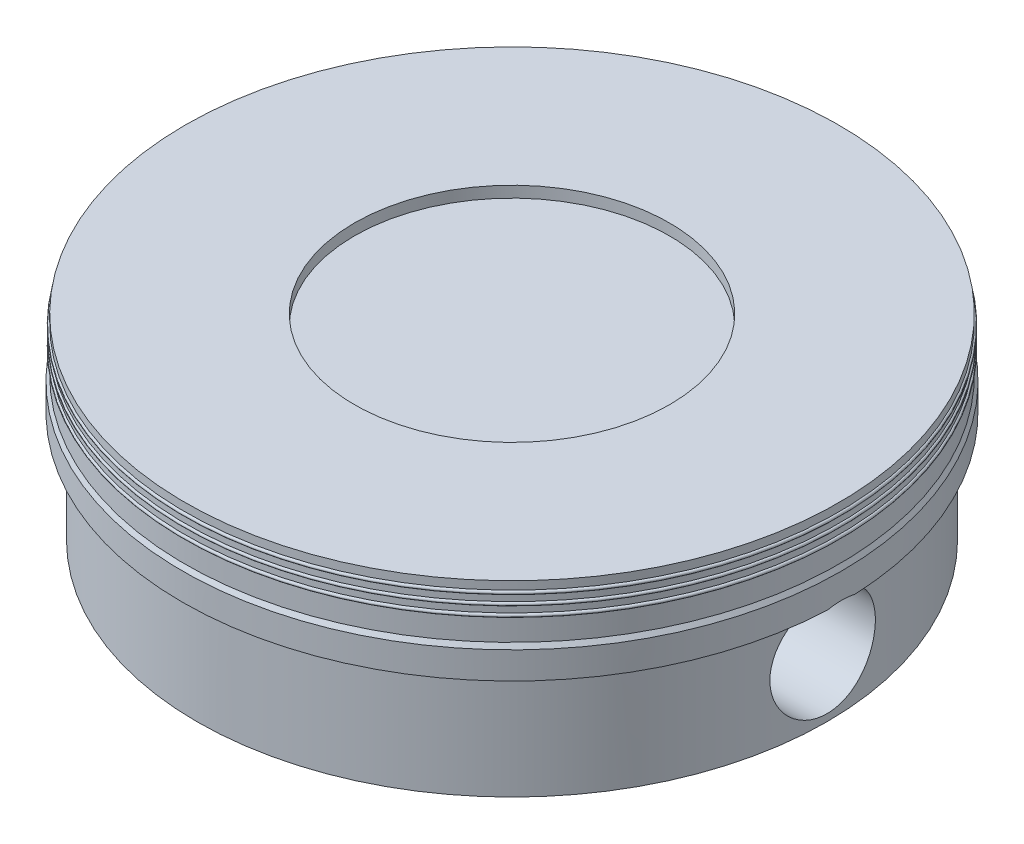
ISO-10303-21;
HEADER;
FILE_DESCRIPTION(('STEP AP214'),'2;1');
FILE_NAME('part.step','',(''),(''),'','','');
FILE_SCHEMA(('AUTOMOTIVE_DESIGN { 1 0 10303 214 1 1 1 1 }'));
ENDSEC;
DATA;
#1=APPLICATION_CONTEXT('core data for automotive mechanical design processes');
#2=APPLICATION_PROTOCOL_DEFINITION('international standard','automotive_design',2000,#1);
#3=PRODUCT_CONTEXT('',#1,'mechanical');
#4=PRODUCT('Part','Part','',(#3));
#5=PRODUCT_RELATED_PRODUCT_CATEGORY('part','',(#4));
#6=PRODUCT_DEFINITION_FORMATION('','',#4);
#7=PRODUCT_DEFINITION_CONTEXT('part definition',#1,'design');
#8=PRODUCT_DEFINITION('design','',#6,#7);
#9=PRODUCT_DEFINITION_SHAPE('','',#8);
#10=(LENGTH_UNIT() NAMED_UNIT(*) SI_UNIT(.MILLI.,.METRE.));
#11=(NAMED_UNIT(*) PLANE_ANGLE_UNIT() SI_UNIT($,.RADIAN.));
#12=(NAMED_UNIT(*) SI_UNIT($,.STERADIAN.) SOLID_ANGLE_UNIT());
#13=UNCERTAINTY_MEASURE_WITH_UNIT(LENGTH_MEASURE(1.E-05),#10,'distance_accuracy_value','');
#14=(GEOMETRIC_REPRESENTATION_CONTEXT(3) GLOBAL_UNCERTAINTY_ASSIGNED_CONTEXT((#13)) GLOBAL_UNIT_ASSIGNED_CONTEXT((#10,
#11,#12)) REPRESENTATION_CONTEXT('',''));
#15=CARTESIAN_POINT('',(0.,0.,0.));
#16=DIRECTION('',(0.,0.,1.));
#17=DIRECTION('',(1.,0.,0.));
#18=AXIS2_PLACEMENT_3D('',#15,#16,#17);
#19=CARTESIAN_POINT('',(5.,1.68,0.));
#20=DIRECTION('',(0.,1.,0.));
#21=DIRECTION('',(-1.,0.,0.));
#22=AXIS2_PLACEMENT_3D('',#19,#20,#21);
#23=PLANE('',#22);
#24=CARTESIAN_POINT('',(0.,1.68,0.));
#25=DIRECTION('',(0.,1.,0.));
#26=DIRECTION('',(-1.,0.,0.));
#27=AXIS2_PLACEMENT_3D('',#24,#25,#26);
#28=CIRCLE('',#27,5.);
#29=CARTESIAN_POINT('',(-4.99582848484613,1.68,0.204200269343622));
#30=VERTEX_POINT('',#29);
#31=CARTESIAN_POINT('',(4.99582848484613,1.68,0.204200269343603));
#32=VERTEX_POINT('',#31);
#33=EDGE_CURVE('E130',#30,#32,#28,.T.);
#34=ORIENTED_EDGE('',*,*,#33,.F.);
#35=DIRECTION('',(1.,0.,0.));
#36=VECTOR('',#35,1.);
#37=CARTESIAN_POINT('',(-5.,1.68,0.204200269343603));
#38=LINE('',#37,#36);
#39=CARTESIAN_POINT('',(-4.77563631885846,1.68,0.204200269343603));
#40=VERTEX_POINT('',#39);
#41=EDGE_CURVE('E116',#30,#40,#38,.T.);
#42=ORIENTED_EDGE('',*,*,#41,.T.);
#43=CARTESIAN_POINT('',(0.,1.68,0.));
#44=DIRECTION('',(0.,1.,0.));
#45=DIRECTION('',(-1.,0.,0.));
#46=AXIS2_PLACEMENT_3D('',#43,#44,#45);
#47=CIRCLE('',#46,4.78);
#48=CARTESIAN_POINT('',(4.77563631885846,1.68,0.204200269343603));
#49=VERTEX_POINT('',#48);
#50=EDGE_CURVE('E11',#40,#49,#47,.T.);
#51=ORIENTED_EDGE('',*,*,#50,.T.);
#52=EDGE_CURVE('E227',#49,#32,#38,.T.);
#53=ORIENTED_EDGE('',*,*,#52,.T.);
#54=EDGE_LOOP('',(#34,#42,#51,#53));
#55=FACE_BOUND('',#54,.T.);
#56=ADVANCED_FACE('F35',(#55),#23,.F.);
#57=CARTESIAN_POINT('',(0.,3.,0.));
#58=DIRECTION('',(0.,1.,0.));
#59=DIRECTION('',(-1.,0.,0.));
#60=AXIS2_PLACEMENT_3D('',#57,#58,#59);
#61=CYLINDRICAL_SURFACE('',#60,3.43);
#62=CARTESIAN_POINT('',(0.,1.93,0.));
#63=DIRECTION('',(0.,1.,0.));
#64=DIRECTION('',(-1.,0.,0.));
#65=AXIS2_PLACEMENT_3D('',#62,#63,#64);
#66=CIRCLE('',#65,3.43);
#67=CARTESIAN_POINT('',(-1.75,1.93,2.94998305079877));
#68=VERTEX_POINT('',#67);
#69=CARTESIAN_POINT('',(1.75,1.93,2.94998305079877));
#70=VERTEX_POINT('',#69);
#71=EDGE_CURVE('E172',#68,#70,#66,.T.);
#72=ORIENTED_EDGE('',*,*,#71,.T.);
#73=DIRECTION('',(0.,-1.,0.));
#74=VECTOR('',#73,1.);
#75=CARTESIAN_POINT('',(1.75,2.972,2.94998305079877));
#76=LINE('',#75,#74);
#77=CARTESIAN_POINT('',(1.75,0.,2.94998305079877));
#78=VERTEX_POINT('',#77);
#79=EDGE_CURVE('E212',#70,#78,#76,.T.);
#80=ORIENTED_EDGE('',*,*,#79,.T.);
#81=CARTESIAN_POINT('',(0.,0.,0.));
#82=DIRECTION('',(0.,1.,0.));
#83=DIRECTION('',(-1.,0.,0.));
#84=AXIS2_PLACEMENT_3D('',#81,#82,#83);
#85=CIRCLE('',#84,3.43);
#86=CARTESIAN_POINT('',(-1.75,0.,2.94998305079877));
#87=VERTEX_POINT('',#86);
#88=EDGE_CURVE('E176',#87,#78,#85,.T.);
#89=ORIENTED_EDGE('',*,*,#88,.F.);
#90=DIRECTION('',(0.,-1.,0.));
#91=VECTOR('',#90,1.);
#92=CARTESIAN_POINT('',(-1.75,2.972,2.94998305079877));
#93=LINE('',#92,#91);
#94=EDGE_CURVE('E190',#68,#87,#93,.T.);
#95=ORIENTED_EDGE('',*,*,#94,.F.);
#96=EDGE_LOOP('',(#72,#80,#89,#95));
#97=FACE_BOUND('',#96,.T.);
#98=ADVANCED_FACE('F263',(#97),#61,.F.);
#99=CARTESIAN_POINT('',(0.,3.,0.));
#100=DIRECTION('',(0.,1.,0.));
#101=DIRECTION('',(-1.,0.,0.));
#102=AXIS2_PLACEMENT_3D('',#99,#100,#101);
#103=CYLINDRICAL_SURFACE('',#102,4.78);
#104=ORIENTED_EDGE('',*,*,#50,.F.);
#105=CARTESIAN_POINT('',(-4.77563631885846,1.68,0.204200269343603));
#106=CARTESIAN_POINT('',(-4.77379194888552,1.66854243257558,0.247744412269054));
#107=CARTESIAN_POINT('',(-4.77136020460172,1.65335275457683,0.290255843607188));
#108=CARTESIAN_POINT('',(-4.76566971325088,1.61612915775609,0.372058639634254));
#109=CARTESIAN_POINT('',(-4.76241182877571,1.59410237237226,0.411353306756016));
#110=CARTESIAN_POINT('',(-4.75541096790896,1.54379414653229,0.485669109751176));
#111=CARTESIAN_POINT('',(-4.75166791325191,1.51551169641926,0.520689554352614));
#112=CARTESIAN_POINT('',(-4.7441177730141,1.45349253539822,0.58549949645576));
#113=CARTESIAN_POINT('',(-4.74031069015471,1.41975605577732,0.615289215663292));
#114=CARTESIAN_POINT('',(-4.73303397938829,1.34752861720671,0.668977437623689));
#115=CARTESIAN_POINT('',(-4.7295665140548,1.30901033693915,0.692839507782657));
#116=CARTESIAN_POINT('',(-4.72339287495312,1.22844891630057,0.733750408895798));
#117=CARTESIAN_POINT('',(-4.72068674764335,1.18640556102534,0.750798824093442));
#118=CARTESIAN_POINT('',(-4.71636619316509,1.10026975546907,0.777478565646626));
#119=CARTESIAN_POINT('',(-4.71474486267495,1.05619220830358,0.787156848877922));
#120=CARTESIAN_POINT('',(-4.71275674229363,0.9670136563161,0.798974764384114));
#121=CARTESIAN_POINT('',(-4.71238978474061,0.921912789084256,0.801115404155712));
#122=CARTESIAN_POINT('',(-4.71294983990002,0.832543950301081,0.797813291403515));
#123=CARTESIAN_POINT('',(-4.71386133355064,0.788272487173592,0.792461490734866));
#124=CARTESIAN_POINT('',(-4.71684522740922,0.701267723805095,0.774501739495545));
#125=CARTESIAN_POINT('',(-4.71891766125525,0.658534468171611,0.761893578672592));
#126=CARTESIAN_POINT('',(-4.72399067289901,0.575744688228178,0.729777359832175));
#127=CARTESIAN_POINT('',(-4.72699241086158,0.535691586324173,0.710260672658385));
#128=CARTESIAN_POINT('',(-4.73358706974061,0.459406153277857,0.664888734674945));
#129=CARTESIAN_POINT('',(-4.73718003553207,0.42317411250206,0.639033002650166));
#130=CARTESIAN_POINT('',(-4.74460835399527,0.355074083527152,0.58133129212891));
#131=CARTESIAN_POINT('',(-4.7484461869205,0.323266716440046,0.549414060942267));
#132=CARTESIAN_POINT('',(-4.75589481733857,0.265438415229614,0.480684029234228));
#133=CARTESIAN_POINT('',(-4.75950560740081,0.239417670418887,0.443871068609236));
#134=CARTESIAN_POINT('',(-4.76611282413811,0.1937973715957,0.366186649534608));
#135=CARTESIAN_POINT('',(-4.76910646912816,0.174226662901789,0.32529799680604));
#136=CARTESIAN_POINT('',(-4.77412075413143,0.142248751906518,0.240753384230137));
#137=CARTESIAN_POINT('',(-4.7761414668929,0.129841014000465,0.197097631561188));
#138=CARTESIAN_POINT('',(-4.77896522061506,0.112661038381091,0.108739604313492));
#139=CARTESIAN_POINT('',(-4.77978064110033,0.107811145780091,0.0640528262830545));
#140=CARTESIAN_POINT('',(-4.78014164687173,0.10565324910312,-0.0255061274608852));
#141=CARTESIAN_POINT('',(-4.77968730623721,0.108344805050244,-0.0703782922062025));
#142=CARTESIAN_POINT('',(-4.77756972345959,0.121126871649608,-0.158615600759262));
#143=CARTESIAN_POINT('',(-4.77591727299164,0.131151340047638,-0.201990600670468));
#144=CARTESIAN_POINT('',(-4.77159751597352,0.158221853564918,-0.286436829840957));
#145=CARTESIAN_POINT('',(-4.76893016987214,0.175268172332879,-0.327507969245552));
#146=CARTESIAN_POINT('',(-4.7628526422157,0.216013300231202,-0.406465125420052));
#147=CARTESIAN_POINT('',(-4.75943800733318,0.239752248368479,-0.444330074183007));
#148=CARTESIAN_POINT('',(-4.75224918030118,0.293172302894487,-0.515569319292179));
#149=CARTESIAN_POINT('',(-4.74847495896288,0.322853891882591,-0.548943250556444));
#150=CARTESIAN_POINT('',(-4.74093522146088,0.387737081541093,-0.610666430914075));
#151=CARTESIAN_POINT('',(-4.73717034238094,0.423000119473012,-0.638951217824218));
#152=CARTESIAN_POINT('',(-4.73012045867174,0.497814299963115,-0.689207240280687));
#153=CARTESIAN_POINT('',(-4.72683545162856,0.537365420948915,-0.711178507586887));
#154=CARTESIAN_POINT('',(-4.72112414577725,0.619631105385139,-0.748156766963228));
#155=CARTESIAN_POINT('',(-4.71869732861466,0.662343740332002,-0.763167964689323));
#156=CARTESIAN_POINT('',(-4.7149837872348,0.749733086105596,-0.785786717984053));
#157=CARTESIAN_POINT('',(-4.71369696033767,0.794409619661804,-0.793394940350896));
#158=CARTESIAN_POINT('',(-4.71242375066639,0.883861115660406,-0.800922574806884));
#159=CARTESIAN_POINT('',(-4.7124213386615,0.928627891215265,-0.800936758926199));
#160=CARTESIAN_POINT('',(-4.71367692374763,1.01752032814333,-0.793513476008895));
#161=CARTESIAN_POINT('',(-4.71493489933995,1.06164600043895,-0.786076136074611));
#162=CARTESIAN_POINT('',(-4.71855673227796,1.1477936410937,-0.764032135205492));
#163=CARTESIAN_POINT('',(-4.72091530598264,1.18982460995637,-0.74945971137407));
#164=CARTESIAN_POINT('',(-4.72646953445655,1.27084839334429,-0.713591784913732));
#165=CARTESIAN_POINT('',(-4.72966517057882,1.30984127552288,-0.692296432047113));
#166=CARTESIAN_POINT('',(-4.73657457074216,1.38412127913754,-0.64333270236432));
#167=CARTESIAN_POINT('',(-4.7402932895619,1.41936652165987,-0.615601505488131));
#168=CARTESIAN_POINT('',(-4.74781191338595,1.48475232853072,-0.554637638840496));
#169=CARTESIAN_POINT('',(-4.7516118616088,1.51489009525213,-0.521401973568509));
#170=CARTESIAN_POINT('',(-4.75890914569777,1.5694910175067,-0.44998379145258));
#171=CARTESIAN_POINT('',(-4.76240297685973,1.59389278081821,-0.411754019783339));
#172=CARTESIAN_POINT('',(-4.76864221547192,1.6358719961542,-0.331736125546161));
#173=CARTESIAN_POINT('',(-4.7713892580788,1.65346439427325,-0.28995604452154));
#174=CARTESIAN_POINT('',(-4.77434621611889,1.67200558892753,-0.232863171892918));
#175=CARTESIAN_POINT('',(-4.77502245159576,1.67620590067565,-0.2185828924918));
#176=CARTESIAN_POINT('',(-4.77563631885846,1.68,-0.204200269343603));
#177=B_SPLINE_CURVE_WITH_KNOTS('',3,(#105,#106,#107,#108,#109,#110,#111,#112,#113,#114,#115,
#116,#117,#118,#119,#120,#121,#122,#123,#124,#125,#126,#127,#128,#129,#130,#131,#132,#133,#134,
#135,#136,#137,#138,#139,#140,#141,#142,#143,#144,#145,#146,#147,#148,#149,#150,#151,#152,#153,
#154,#155,#156,#157,#158,#159,#160,#161,#162,#163,#164,#165,#166,#167,#168,#169,#170,#171,#172,
#173,#174,#175,#176),.UNSPECIFIED.,.F.,.F.,(4,2,2,2,2,2,2,2,2,2,2,2,2,2,2,2,2,2,2,2,2,2,2,2,2,2,
2,2,2,2,2,2,2,2,2,4),(0.,0.134994326225649,0.269848278013811,0.404724010973235,
0.539594025804639,0.675273538402806,0.81096132864847,0.945777214580323,1.08057508006346,
1.21375072872941,1.3469302363402,1.48027668341513,1.61363325633846,1.74866713589456,
1.88370543251019,2.01933969090956,2.15496380606526,2.28918500918092,2.42339838183809,
2.5564176455071,2.68944209356374,2.82328197712698,2.95713273418294,3.09257498984084,
3.22801656415072,3.36337619022746,3.4987236231104,3.63238190809012,3.76603791326899,
3.89905877507421,4.0320766738697,4.16645204477797,4.30090078374122,4.43672892789274,
4.57225722456914,4.61693329590087),.UNSPECIFIED.);
#178=CARTESIAN_POINT('',(-4.77563631885846,1.68,-0.204200269343603));
#179=VERTEX_POINT('',#178);
#180=EDGE_CURVE('E250',#40,#179,#177,.T.);
#181=ORIENTED_EDGE('',*,*,#180,.T.);
#182=CARTESIAN_POINT('',(4.77563631885846,1.68,-0.204200269343603));
#183=VERTEX_POINT('',#182);
#184=EDGE_CURVE('E45',#183,#179,#47,.T.);
#185=ORIENTED_EDGE('',*,*,#184,.F.);
#186=CARTESIAN_POINT('',(4.77563631885846,1.68,-0.204200269343603));
#187=CARTESIAN_POINT('',(4.77379194888552,1.66854243257558,-0.247744412269054));
#188=CARTESIAN_POINT('',(4.77136020460172,1.65335275457683,-0.290255843607188));
#189=CARTESIAN_POINT('',(4.76566971325088,1.61612915775609,-0.372058639634254));
#190=CARTESIAN_POINT('',(4.76241182877571,1.59410237237226,-0.411353306756016));
#191=CARTESIAN_POINT('',(4.75541096790896,1.54379414653229,-0.485669109751176));
#192=CARTESIAN_POINT('',(4.75166791325191,1.51551169641926,-0.520689554352614));
#193=CARTESIAN_POINT('',(4.7441177730141,1.45349253539822,-0.58549949645576));
#194=CARTESIAN_POINT('',(4.74031069015471,1.41975605577732,-0.615289215663292));
#195=CARTESIAN_POINT('',(4.73303397938829,1.34752861720671,-0.668977437623689));
#196=CARTESIAN_POINT('',(4.7295665140548,1.30901033693915,-0.692839507782657));
#197=CARTESIAN_POINT('',(4.72339287495312,1.22844891630057,-0.733750408895798));
#198=CARTESIAN_POINT('',(4.72068674764335,1.18640556102534,-0.750798824093442));
#199=CARTESIAN_POINT('',(4.71636619316509,1.10026975546907,-0.777478565646626));
#200=CARTESIAN_POINT('',(4.71474486267495,1.05619220830358,-0.787156848877922));
#201=CARTESIAN_POINT('',(4.71275674229363,0.9670136563161,-0.798974764384114));
#202=CARTESIAN_POINT('',(4.71238978474061,0.921912789084256,-0.801115404155712));
#203=CARTESIAN_POINT('',(4.71294983990002,0.832543950301081,-0.797813291403515));
#204=CARTESIAN_POINT('',(4.71386133355064,0.788272487173592,-0.792461490734866));
#205=CARTESIAN_POINT('',(4.71684522740922,0.701267723805095,-0.774501739495545));
#206=CARTESIAN_POINT('',(4.71891766125525,0.658534468171611,-0.761893578672592));
#207=CARTESIAN_POINT('',(4.72399067289901,0.575744688228178,-0.729777359832175));
#208=CARTESIAN_POINT('',(4.72699241086158,0.535691586324173,-0.710260672658385));
#209=CARTESIAN_POINT('',(4.73358706974061,0.459406153277857,-0.664888734674945));
#210=CARTESIAN_POINT('',(4.73718003553207,0.42317411250206,-0.639033002650166));
#211=CARTESIAN_POINT('',(4.74460835399527,0.355074083527152,-0.58133129212891));
#212=CARTESIAN_POINT('',(4.7484461869205,0.323266716440046,-0.549414060942267));
#213=CARTESIAN_POINT('',(4.75589481733857,0.265438415229614,-0.480684029234228));
#214=CARTESIAN_POINT('',(4.75950560740081,0.239417670418887,-0.443871068609236));
#215=CARTESIAN_POINT('',(4.76611282413811,0.1937973715957,-0.366186649534608));
#216=CARTESIAN_POINT('',(4.76910646912816,0.174226662901789,-0.32529799680604));
#217=CARTESIAN_POINT('',(4.77412075413143,0.142248751906518,-0.240753384230137));
#218=CARTESIAN_POINT('',(4.7761414668929,0.129841014000465,-0.197097631561188));
#219=CARTESIAN_POINT('',(4.77896522061506,0.112661038381091,-0.108739604313492));
#220=CARTESIAN_POINT('',(4.77978064110033,0.107811145780091,-0.0640528262830545));
#221=CARTESIAN_POINT('',(4.78014164687173,0.10565324910312,0.0255061274608852));
#222=CARTESIAN_POINT('',(4.77968730623721,0.108344805050244,0.0703782922062025));
#223=CARTESIAN_POINT('',(4.77756972345959,0.121126871649608,0.158615600759262));
#224=CARTESIAN_POINT('',(4.77591727299164,0.131151340047638,0.201990600670468));
#225=CARTESIAN_POINT('',(4.77159751597352,0.158221853564918,0.286436829840957));
#226=CARTESIAN_POINT('',(4.76893016987214,0.175268172332879,0.327507969245552));
#227=CARTESIAN_POINT('',(4.7628526422157,0.216013300231202,0.406465125420052));
#228=CARTESIAN_POINT('',(4.75943800733318,0.239752248368479,0.444330074183007));
#229=CARTESIAN_POINT('',(4.75224918030118,0.293172302894487,0.515569319292179));
#230=CARTESIAN_POINT('',(4.74847495896288,0.322853891882591,0.548943250556444));
#231=CARTESIAN_POINT('',(4.74093522146088,0.387737081541093,0.610666430914075));
#232=CARTESIAN_POINT('',(4.73717034238094,0.423000119473012,0.638951217824218));
#233=CARTESIAN_POINT('',(4.73012045867174,0.497814299963115,0.689207240280687));
#234=CARTESIAN_POINT('',(4.72683545162856,0.537365420948915,0.711178507586887));
#235=CARTESIAN_POINT('',(4.72112414577725,0.619631105385139,0.748156766963228));
#236=CARTESIAN_POINT('',(4.71869732861466,0.662343740332002,0.763167964689323));
#237=CARTESIAN_POINT('',(4.7149837872348,0.749733086105596,0.785786717984053));
#238=CARTESIAN_POINT('',(4.71369696033767,0.794409619661804,0.793394940350896));
#239=CARTESIAN_POINT('',(4.71242375066639,0.883861115660406,0.800922574806884));
#240=CARTESIAN_POINT('',(4.7124213386615,0.928627891215265,0.800936758926199));
#241=CARTESIAN_POINT('',(4.71367692374763,1.01752032814333,0.793513476008895));
#242=CARTESIAN_POINT('',(4.71493489933995,1.06164600043895,0.786076136074611));
#243=CARTESIAN_POINT('',(4.71855673227796,1.1477936410937,0.764032135205492));
#244=CARTESIAN_POINT('',(4.72091530598264,1.18982460995637,0.74945971137407));
#245=CARTESIAN_POINT('',(4.72646953445655,1.27084839334429,0.713591784913732));
#246=CARTESIAN_POINT('',(4.72966517057882,1.30984127552288,0.692296432047113));
#247=CARTESIAN_POINT('',(4.73657457074216,1.38412127913754,0.64333270236432));
#248=CARTESIAN_POINT('',(4.7402932895619,1.41936652165987,0.615601505488131));
#249=CARTESIAN_POINT('',(4.74781191338595,1.48475232853072,0.554637638840496));
#250=CARTESIAN_POINT('',(4.7516118616088,1.51489009525213,0.521401973568509));
#251=CARTESIAN_POINT('',(4.75890914569777,1.5694910175067,0.44998379145258));
#252=CARTESIAN_POINT('',(4.76240297685973,1.59389278081821,0.411754019783339));
#253=CARTESIAN_POINT('',(4.76864221547192,1.6358719961542,0.331736125546161));
#254=CARTESIAN_POINT('',(4.7713892580788,1.65346439427325,0.28995604452154));
#255=CARTESIAN_POINT('',(4.77434621611889,1.67200558892753,0.232863171892918));
#256=CARTESIAN_POINT('',(4.77502245159576,1.67620590067565,0.2185828924918));
#257=CARTESIAN_POINT('',(4.77563631885846,1.68,0.204200269343603));
#258=B_SPLINE_CURVE_WITH_KNOTS('',3,(#186,#187,#188,#189,#190,#191,#192,#193,#194,#195,#196,
#197,#198,#199,#200,#201,#202,#203,#204,#205,#206,#207,#208,#209,#210,#211,#212,#213,#214,#215,
#216,#217,#218,#219,#220,#221,#222,#223,#224,#225,#226,#227,#228,#229,#230,#231,#232,#233,#234,
#235,#236,#237,#238,#239,#240,#241,#242,#243,#244,#245,#246,#247,#248,#249,#250,#251,#252,#253,
#254,#255,#256,#257),.UNSPECIFIED.,.F.,.F.,(4,2,2,2,2,2,2,2,2,2,2,2,2,2,2,2,2,2,2,2,2,2,2,2,2,2,
2,2,2,2,2,2,2,2,2,4),(0.,0.134994326225649,0.269848278013811,0.404724010973235,
0.539594025804639,0.675273538402806,0.81096132864847,0.945777214580323,1.08057508006346,
1.21375072872941,1.3469302363402,1.48027668341513,1.61363325633846,1.74866713589456,
1.88370543251019,2.01933969090956,2.15496380606526,2.28918500918092,2.42339838183809,
2.5564176455071,2.68944209356374,2.82328197712698,2.95713273418294,3.09257498984084,
3.22801656415072,3.36337619022746,3.4987236231104,3.63238190809012,3.76603791326899,
3.89905877507421,4.0320766738697,4.16645204477797,4.30090078374122,4.43672892789274,
4.57225722456914,4.61693329590087),.UNSPECIFIED.);
#259=EDGE_CURVE('E219',#183,#49,#258,.T.);
#260=ORIENTED_EDGE('',*,*,#259,.T.);
#261=EDGE_LOOP('',(#104,#181,#185,#260));
#262=FACE_BOUND('',#261,.T.);
#263=CARTESIAN_POINT('',(0.,0.,0.));
#264=DIRECTION('',(0.,1.,0.));
#265=DIRECTION('',(-1.,0.,0.));
#266=AXIS2_PLACEMENT_3D('',#263,#264,#265);
#267=CIRCLE('',#266,4.78);
#268=CARTESIAN_POINT('',(-4.78,0.,0.));
#269=VERTEX_POINT('',#268);
#270=EDGE_CURVE('E180',#269,#269,#267,.T.);
#271=ORIENTED_EDGE('',*,*,#270,.T.);
#272=EDGE_LOOP('',(#271));
#273=FACE_BOUND('',#272,.T.);
#274=ADVANCED_FACE('F37',(#262,#273),#103,.T.);
#275=CARTESIAN_POINT('',(4.99582848484613,1.68,-0.204200269343622));
#276=VERTEX_POINT('',#275);
#277=CARTESIAN_POINT('',(-4.99582848484613,1.68,-0.204200269343603));
#278=VERTEX_POINT('',#277);
#279=EDGE_CURVE('E125',#276,#278,#28,.T.);
#280=ORIENTED_EDGE('',*,*,#279,.F.);
#281=DIRECTION('',(1.,0.,0.));
#282=VECTOR('',#281,1.);
#283=CARTESIAN_POINT('',(-5.,1.68,-0.204200269343603));
#284=LINE('',#283,#282);
#285=EDGE_CURVE('E128',#276,#183,#284,.F.);
#286=ORIENTED_EDGE('',*,*,#285,.T.);
#287=ORIENTED_EDGE('',*,*,#184,.T.);
#288=EDGE_CURVE('E113',#179,#278,#284,.F.);
#289=ORIENTED_EDGE('',*,*,#288,.T.);
#290=EDGE_LOOP('',(#280,#286,#287,#289));
#291=FACE_BOUND('',#290,.T.);
#292=ADVANCED_FACE('F123',(#291),#23,.F.);
#293=CARTESIAN_POINT('',(0.,3.,0.));
#294=DIRECTION('',(0.,1.,0.));
#295=DIRECTION('',(-1.,0.,0.));
#296=AXIS2_PLACEMENT_3D('',#293,#294,#295);
#297=CYLINDRICAL_SURFACE('',#296,5.);
#298=CARTESIAN_POINT('',(0.,2.09,0.));
#299=DIRECTION('',(0.,1.,0.));
#300=DIRECTION('',(-1.,0.,0.));
#301=AXIS2_PLACEMENT_3D('',#298,#299,#300);
#302=CIRCLE('',#301,5.);
#303=CARTESIAN_POINT('',(-5.,2.09,0.));
#304=VERTEX_POINT('',#303);
#305=EDGE_CURVE('E131',#304,#304,#302,.T.);
#306=ORIENTED_EDGE('',*,*,#305,.F.);
#307=EDGE_LOOP('',(#306));
#308=FACE_BOUND('',#307,.T.);
#309=ORIENTED_EDGE('',*,*,#33,.T.);
#310=CARTESIAN_POINT('',(4.99582848484613,1.68,0.204200269343603));
#311=CARTESIAN_POINT('',(4.99671726527622,1.68573567061046,0.182470448527012));
#312=CARTESIAN_POINT('',(4.99747214482284,1.69055442079515,0.160507025821703));
#313=CARTESIAN_POINT('',(4.99869771630284,1.69833005884354,0.116238538748057));
#314=CARTESIAN_POINT('',(4.99916832286338,1.70128638739636,0.0939333738078289));
#315=CARTESIAN_POINT('',(5.00011402038239,1.70722470830864,0.0277239484352171));
#316=CARTESIAN_POINT('',(5.00016427223512,1.7075354872144,-0.0164665349355051));
#317=CARTESIAN_POINT('',(4.9993452065729,1.7023978032236,-0.0844772002820847));
#318=CARTESIAN_POINT('',(4.99887889019159,1.69947412393192,-0.108529380491495));
#319=CARTESIAN_POINT('',(4.99760713721798,1.6914146067021,-0.156550261147517));
#320=CARTESIAN_POINT('',(4.99679767293207,1.68625247795534,-0.180514444994168));
#321=CARTESIAN_POINT('',(4.99582848484614,1.68000000000026,-0.204200269343623));
#322=B_SPLINE_CURVE_WITH_KNOTS('',3,(#310,#311,#312,#313,#314,#315,#316,#317,#318,#319,#320,
#321),.UNSPECIFIED.,.F.,.F.,(4,2,2,2,2,4),(0.,0.0674275414034377,0.134875322585593,
0.266729456884676,0.33934409468026,0.412835733322213),.UNSPECIFIED.);
#323=EDGE_CURVE('E52',#32,#276,#322,.T.);
#324=ORIENTED_EDGE('',*,*,#323,.T.);
#325=ORIENTED_EDGE('',*,*,#279,.T.);
#326=CARTESIAN_POINT('',(-4.99582848484613,1.68,-0.204200269343603));
#327=CARTESIAN_POINT('',(-4.99671726527622,1.68573567061046,-0.182470448527012));
#328=CARTESIAN_POINT('',(-4.99747214482284,1.69055442079515,-0.160507025821703));
#329=CARTESIAN_POINT('',(-4.99869771630284,1.69833005884354,-0.116238538748057));
#330=CARTESIAN_POINT('',(-4.99916832286338,1.70128638739636,-0.0939333738078289));
#331=CARTESIAN_POINT('',(-5.00011402038239,1.70722470830864,-0.0277239484352171));
#332=CARTESIAN_POINT('',(-5.00016427223512,1.7075354872144,0.0164665349355051));
#333=CARTESIAN_POINT('',(-4.9993452065729,1.7023978032236,0.0844772002820847));
#334=CARTESIAN_POINT('',(-4.99887889019159,1.69947412393192,0.108529380491495));
#335=CARTESIAN_POINT('',(-4.99760713721798,1.6914146067021,0.156550261147517));
#336=CARTESIAN_POINT('',(-4.99679767293207,1.68625247795534,0.180514444994168));
#337=CARTESIAN_POINT('',(-4.99582848484614,1.68000000000026,0.204200269343623));
#338=B_SPLINE_CURVE_WITH_KNOTS('',3,(#326,#327,#328,#329,#330,#331,#332,#333,#334,#335,#336,
#337),.UNSPECIFIED.,.F.,.F.,(4,2,2,2,2,4),(0.,0.0674275414034377,0.134875322585593,
0.266729456884676,0.33934409468026,0.412835733322213),.UNSPECIFIED.);
#339=EDGE_CURVE('E57',#278,#30,#338,.T.);
#340=ORIENTED_EDGE('',*,*,#339,.T.);
#341=EDGE_LOOP('',(#309,#324,#325,#340));
#342=FACE_BOUND('',#341,.T.);
#343=ADVANCED_FACE('F129',(#308,#342),#297,.T.);
#344=CARTESIAN_POINT('',(0.,2.09,0.));
#345=DIRECTION('',(0.,-1.,0.));
#346=DIRECTION('',(1.,0.,0.));
#347=AXIS2_PLACEMENT_3D('',#344,#345,#346);
#348=CONICAL_SURFACE('',#347,5.,0.519146114246523);
#349=CARTESIAN_POINT('',(0.,2.16,0.));
#350=DIRECTION('',(0.,1.,0.));
#351=DIRECTION('',(-1.,0.,0.));
#352=AXIS2_PLACEMENT_3D('',#349,#350,#351);
#353=CIRCLE('',#352,4.96);
#354=CARTESIAN_POINT('',(-4.96,2.16,0.));
#355=VERTEX_POINT('',#354);
#356=EDGE_CURVE('E134',#355,#355,#353,.T.);
#357=ORIENTED_EDGE('',*,*,#356,.F.);
#358=EDGE_LOOP('',(#357));
#359=FACE_BOUND('',#358,.T.);
#360=ORIENTED_EDGE('',*,*,#305,.T.);
#361=EDGE_LOOP('',(#360));
#362=FACE_BOUND('',#361,.T.);
#363=ADVANCED_FACE('F275',(#359,#362),#348,.T.);
#364=CARTESIAN_POINT('',(0.,3.,0.));
#365=DIRECTION('',(0.,1.,0.));
#366=DIRECTION('',(-1.,0.,0.));
#367=AXIS2_PLACEMENT_3D('',#364,#365,#366);
#368=CYLINDRICAL_SURFACE('',#367,4.96);
#369=CARTESIAN_POINT('',(0.,2.49353731935163,0.));
#370=DIRECTION('',(0.,1.,0.));
#371=DIRECTION('',(-1.,0.,0.));
#372=AXIS2_PLACEMENT_3D('',#369,#370,#371);
#373=CIRCLE('',#372,4.96);
#374=CARTESIAN_POINT('',(-4.96,2.49353731935163,0.));
#375=VERTEX_POINT('',#374);
#376=EDGE_CURVE('E139',#375,#375,#373,.T.);
#377=ORIENTED_EDGE('',*,*,#376,.F.);
#378=EDGE_LOOP('',(#377));
#379=FACE_BOUND('',#378,.T.);
#380=ORIENTED_EDGE('',*,*,#356,.T.);
#381=EDGE_LOOP('',(#380));
#382=FACE_BOUND('',#381,.T.);
#383=ADVANCED_FACE('F407',(#379,#382),#368,.T.);
#384=CARTESIAN_POINT('',(0.,2.52,0.));
#385=DIRECTION('',(0.,1.,0.));
#386=DIRECTION('',(-1.,0.,0.));
#387=AXIS2_PLACEMENT_3D('',#384,#385,#386);
#388=TOROIDAL_SURFACE('',#387,4.96,0.0264626806483672);
#389=CARTESIAN_POINT('',(0.,2.54646268064837,0.));
#390=DIRECTION('',(0.,1.,0.));
#391=DIRECTION('',(-1.,0.,0.));
#392=AXIS2_PLACEMENT_3D('',#389,#390,#391);
#393=CIRCLE('',#392,4.96);
#394=CARTESIAN_POINT('',(-4.96,2.54646268064837,0.));
#395=VERTEX_POINT('',#394);
#396=EDGE_CURVE('E142',#395,#395,#393,.T.);
#397=ORIENTED_EDGE('',*,*,#396,.F.);
#398=EDGE_LOOP('',(#397));
#399=FACE_BOUND('',#398,.T.);
#400=ORIENTED_EDGE('',*,*,#376,.T.);
#401=EDGE_LOOP('',(#400));
#402=FACE_BOUND('',#401,.T.);
#403=ADVANCED_FACE('F414',(#399,#402),#388,.T.);
#404=CARTESIAN_POINT('',(0.,3.,0.));
#405=DIRECTION('',(0.,1.,0.));
#406=DIRECTION('',(-1.,0.,0.));
#407=AXIS2_PLACEMENT_3D('',#404,#405,#406);
#408=CYLINDRICAL_SURFACE('',#407,4.96);
#409=CARTESIAN_POINT('',(0.,2.64476331004766,0.));
#410=DIRECTION('',(0.,1.,0.));
#411=DIRECTION('',(-1.,0.,0.));
#412=AXIS2_PLACEMENT_3D('',#409,#410,#411);
#413=CIRCLE('',#412,4.96);
#414=CARTESIAN_POINT('',(-4.96,2.64476331004766,0.));
#415=VERTEX_POINT('',#414);
#416=EDGE_CURVE('E145',#415,#415,#413,.T.);
#417=ORIENTED_EDGE('',*,*,#416,.F.);
#418=EDGE_LOOP('',(#417));
#419=FACE_BOUND('',#418,.T.);
#420=ORIENTED_EDGE('',*,*,#396,.T.);
#421=EDGE_LOOP('',(#420));
#422=FACE_BOUND('',#421,.T.);
#423=ADVANCED_FACE('F423',(#419,#422),#408,.T.);
#424=CARTESIAN_POINT('',(0.,2.67,0.));
#425=DIRECTION('',(0.,1.,0.));
#426=DIRECTION('',(-1.,0.,0.));
#427=AXIS2_PLACEMENT_3D('',#424,#425,#426);
#428=TOROIDAL_SURFACE('',#427,4.96,0.0252366899523406);
#429=CARTESIAN_POINT('',(0.,2.69523668995234,0.));
#430=DIRECTION('',(0.,1.,0.));
#431=DIRECTION('',(-1.,0.,0.));
#432=AXIS2_PLACEMENT_3D('',#429,#430,#431);
#433=CIRCLE('',#432,4.96);
#434=CARTESIAN_POINT('',(-4.96,2.69523668995234,0.));
#435=VERTEX_POINT('',#434);
#436=EDGE_CURVE('E148',#435,#435,#433,.T.);
#437=ORIENTED_EDGE('',*,*,#436,.F.);
#438=EDGE_LOOP('',(#437));
#439=FACE_BOUND('',#438,.T.);
#440=ORIENTED_EDGE('',*,*,#416,.T.);
#441=EDGE_LOOP('',(#440));
#442=FACE_BOUND('',#441,.T.);
#443=ADVANCED_FACE('F431',(#439,#442),#428,.T.);
#444=CARTESIAN_POINT('',(0.,3.,0.));
#445=DIRECTION('',(0.,1.,0.));
#446=DIRECTION('',(-1.,0.,0.));
#447=AXIS2_PLACEMENT_3D('',#444,#445,#446);
#448=CYLINDRICAL_SURFACE('',#447,4.96);
#449=CARTESIAN_POINT('',(0.,2.79353731935163,0.));
#450=DIRECTION('',(0.,1.,0.));
#451=DIRECTION('',(-1.,0.,0.));
#452=AXIS2_PLACEMENT_3D('',#449,#450,#451);
#453=CIRCLE('',#452,4.96);
#454=CARTESIAN_POINT('',(-4.96,2.79353731935163,0.));
#455=VERTEX_POINT('',#454);
#456=EDGE_CURVE('E151',#455,#455,#453,.T.);
#457=ORIENTED_EDGE('',*,*,#456,.F.);
#458=EDGE_LOOP('',(#457));
#459=FACE_BOUND('',#458,.T.);
#460=ORIENTED_EDGE('',*,*,#436,.T.);
#461=EDGE_LOOP('',(#460));
#462=FACE_BOUND('',#461,.T.);
#463=ADVANCED_FACE('F439',(#459,#462),#448,.T.);
#464=CARTESIAN_POINT('',(0.,2.82,0.));
#465=DIRECTION('',(0.,1.,0.));
#466=DIRECTION('',(-1.,0.,0.));
#467=AXIS2_PLACEMENT_3D('',#464,#465,#466);
#468=TOROIDAL_SURFACE('',#467,4.96,0.0264626806483672);
#469=CARTESIAN_POINT('',(0.,2.84646268064837,0.));
#470=DIRECTION('',(0.,1.,0.));
#471=DIRECTION('',(-1.,0.,0.));
#472=AXIS2_PLACEMENT_3D('',#469,#470,#471);
#473=CIRCLE('',#472,4.96);
#474=CARTESIAN_POINT('',(-4.96,2.84646268064837,0.));
#475=VERTEX_POINT('',#474);
#476=EDGE_CURVE('E154',#475,#475,#473,.T.);
#477=ORIENTED_EDGE('',*,*,#476,.F.);
#478=EDGE_LOOP('',(#477));
#479=FACE_BOUND('',#478,.T.);
#480=ORIENTED_EDGE('',*,*,#456,.T.);
#481=EDGE_LOOP('',(#480));
#482=FACE_BOUND('',#481,.T.);
#483=ADVANCED_FACE('F447',(#479,#482),#468,.T.);
#484=CARTESIAN_POINT('',(0.,3.,0.));
#485=DIRECTION('',(0.,1.,0.));
#486=DIRECTION('',(-1.,0.,0.));
#487=AXIS2_PLACEMENT_3D('',#484,#485,#486);
#488=CYLINDRICAL_SURFACE('',#487,4.96);
#489=CARTESIAN_POINT('',(0.,2.97,0.));
#490=DIRECTION('',(0.,1.,0.));
#491=DIRECTION('',(-1.,0.,0.));
#492=AXIS2_PLACEMENT_3D('',#489,#490,#491);
#493=CIRCLE('',#492,4.96);
#494=CARTESIAN_POINT('',(-4.96,2.97,0.));
#495=VERTEX_POINT('',#494);
#496=EDGE_CURVE('E157',#495,#495,#493,.T.);
#497=ORIENTED_EDGE('',*,*,#496,.F.);
#498=EDGE_LOOP('',(#497));
#499=FACE_BOUND('',#498,.T.);
#500=ORIENTED_EDGE('',*,*,#476,.T.);
#501=EDGE_LOOP('',(#500));
#502=FACE_BOUND('',#501,.T.);
#503=ADVANCED_FACE('F455',(#499,#502),#488,.T.);
#504=CARTESIAN_POINT('',(2.39,2.97,0.));
#505=DIRECTION('',(0.,-1.,0.));
#506=DIRECTION('',(1.,0.,0.));
#507=AXIS2_PLACEMENT_3D('',#504,#505,#506);
#508=PLANE('',#507);
#509=CARTESIAN_POINT('',(0.,2.97,0.));
#510=DIRECTION('',(0.,1.,0.));
#511=DIRECTION('',(-1.,0.,0.));
#512=AXIS2_PLACEMENT_3D('',#509,#510,#511);
#513=CIRCLE('',#512,2.39);
#514=CARTESIAN_POINT('',(-2.39,2.97,0.));
#515=VERTEX_POINT('',#514);
#516=EDGE_CURVE('E160',#515,#515,#513,.T.);
#517=ORIENTED_EDGE('',*,*,#516,.F.);
#518=EDGE_LOOP('',(#517));
#519=FACE_BOUND('',#518,.T.);
#520=ORIENTED_EDGE('',*,*,#496,.T.);
#521=EDGE_LOOP('',(#520));
#522=FACE_BOUND('',#521,.T.);
#523=ADVANCED_FACE('F462',(#519,#522),#508,.F.);
#524=CARTESIAN_POINT('',(0.,3.,0.));
#525=DIRECTION('',(0.,1.,0.));
#526=DIRECTION('',(-1.,0.,0.));
#527=AXIS2_PLACEMENT_3D('',#524,#525,#526);
#528=CYLINDRICAL_SURFACE('',#527,2.39);
#529=CARTESIAN_POINT('',(0.,2.8,0.));
#530=DIRECTION('',(0.,1.,0.));
#531=DIRECTION('',(-1.,0.,0.));
#532=AXIS2_PLACEMENT_3D('',#529,#530,#531);
#533=CIRCLE('',#532,2.39);
#534=CARTESIAN_POINT('',(-2.39,2.8,0.));
#535=VERTEX_POINT('',#534);
#536=EDGE_CURVE('E163',#535,#535,#533,.T.);
#537=ORIENTED_EDGE('',*,*,#536,.F.);
#538=EDGE_LOOP('',(#537));
#539=FACE_BOUND('',#538,.T.);
#540=ORIENTED_EDGE('',*,*,#516,.T.);
#541=EDGE_LOOP('',(#540));
#542=FACE_BOUND('',#541,.T.);
#543=ADVANCED_FACE('F470',(#539,#542),#528,.F.);
#544=CARTESIAN_POINT('',(0.,2.8,0.));
#545=DIRECTION('',(0.,-1.,0.));
#546=DIRECTION('',(1.,0.,0.));
#547=AXIS2_PLACEMENT_3D('',#544,#545,#546);
#548=PLANE('',#547);
#549=ORIENTED_EDGE('',*,*,#536,.T.);
#550=EDGE_LOOP('',(#549));
#551=FACE_BOUND('',#550,.T.);
#552=ADVANCED_FACE('F301',(#551),#548,.F.);
#553=CARTESIAN_POINT('',(4.2,2.33,0.));
#554=DIRECTION('',(0.,1.,0.));
#555=DIRECTION('',(-1.,0.,0.));
#556=AXIS2_PLACEMENT_3D('',#553,#554,#555);
#557=PLANE('',#556);
#558=DIRECTION('',(0.,0.,-1.));
#559=VECTOR('',#558,1.);
#560=CARTESIAN_POINT('',(1.75,2.33,2.94998305079877));
#561=LINE('',#560,#559);
#562=CARTESIAN_POINT('',(1.75,2.33,2.94998305079877));
#563=VERTEX_POINT('',#562);
#564=CARTESIAN_POINT('',(1.75,2.33,-2.94998305079877));
#565=VERTEX_POINT('',#564);
#566=EDGE_CURVE('E214',#563,#565,#561,.T.);
#567=ORIENTED_EDGE('',*,*,#566,.F.);
#568=CARTESIAN_POINT('',(0.,2.33,0.));
#569=DIRECTION('',(0.,1.,0.));
#570=DIRECTION('',(-1.,0.,0.));
#571=AXIS2_PLACEMENT_3D('',#568,#569,#570);
#572=CIRCLE('',#571,3.43);
#573=EDGE_CURVE('E216',#565,#563,#572,.F.);
#574=ORIENTED_EDGE('',*,*,#573,.F.);
#575=EDGE_LOOP('',(#567,#574));
#576=FACE_BOUND('',#575,.T.);
#577=DIRECTION('',(0.,0.,1.));
#578=VECTOR('',#577,1.);
#579=CARTESIAN_POINT('',(-1.75,2.33,2.94998305079877));
#580=LINE('',#579,#578);
#581=CARTESIAN_POINT('',(-1.75,2.33,-2.94998305079877));
#582=VERTEX_POINT('',#581);
#583=CARTESIAN_POINT('',(-1.75,2.33,2.94998305079877));
#584=VERTEX_POINT('',#583);
#585=EDGE_CURVE('E196',#582,#584,#580,.T.);
#586=ORIENTED_EDGE('',*,*,#585,.F.);
#587=CARTESIAN_POINT('',(0.,2.33,0.));
#588=DIRECTION('',(0.,1.,0.));
#589=DIRECTION('',(-1.,0.,0.));
#590=AXIS2_PLACEMENT_3D('',#587,#588,#589);
#591=CIRCLE('',#590,3.43);
#592=EDGE_CURVE('E198',#584,#582,#591,.F.);
#593=ORIENTED_EDGE('',*,*,#592,.F.);
#594=EDGE_LOOP('',(#586,#593));
#595=FACE_BOUND('',#594,.T.);
#596=CARTESIAN_POINT('',(0.,2.33,0.));
#597=DIRECTION('',(0.,1.,0.));
#598=DIRECTION('',(-1.,0.,0.));
#599=AXIS2_PLACEMENT_3D('',#596,#597,#598);
#600=CIRCLE('',#599,4.2);
#601=CARTESIAN_POINT('',(-4.2,2.33,0.));
#602=VERTEX_POINT('',#601);
#603=EDGE_CURVE('E166',#602,#602,#600,.T.);
#604=ORIENTED_EDGE('',*,*,#603,.F.);
#605=EDGE_LOOP('',(#604));
#606=FACE_BOUND('',#605,.T.);
#607=ADVANCED_FACE('F296',(#576,#595,#606),#557,.F.);
#608=CARTESIAN_POINT('',(0.,3.,0.));
#609=DIRECTION('',(0.,1.,0.));
#610=DIRECTION('',(-1.,0.,0.));
#611=AXIS2_PLACEMENT_3D('',#608,#609,#610);
#612=CYLINDRICAL_SURFACE('',#611,4.2);
#613=CARTESIAN_POINT('',(0.,1.93,0.));
#614=DIRECTION('',(0.,1.,0.));
#615=DIRECTION('',(-1.,0.,0.));
#616=AXIS2_PLACEMENT_3D('',#613,#614,#615);
#617=CIRCLE('',#616,4.2);
#618=CARTESIAN_POINT('',(-4.2,1.93,0.));
#619=VERTEX_POINT('',#618);
#620=EDGE_CURVE('E169',#619,#619,#617,.T.);
#621=ORIENTED_EDGE('',*,*,#620,.F.);
#622=EDGE_LOOP('',(#621));
#623=FACE_BOUND('',#622,.T.);
#624=ORIENTED_EDGE('',*,*,#603,.T.);
#625=EDGE_LOOP('',(#624));
#626=FACE_BOUND('',#625,.T.);
#627=ADVANCED_FACE('F291',(#623,#626),#612,.F.);
#628=CARTESIAN_POINT('',(3.43,1.93,0.));
#629=DIRECTION('',(0.,-1.,0.));
#630=DIRECTION('',(1.,0.,0.));
#631=AXIS2_PLACEMENT_3D('',#628,#629,#630);
#632=PLANE('',#631);
#633=ORIENTED_EDGE('',*,*,#71,.F.);
#634=CARTESIAN_POINT('',(0.,1.93,0.));
#635=DIRECTION('',(0.,-1.,0.));
#636=DIRECTION('',(1.,0.,0.));
#637=AXIS2_PLACEMENT_3D('',#634,#635,#636);
#638=CIRCLE('',#637,3.43);
#639=CARTESIAN_POINT('',(-1.75,1.93,-2.94998305079877));
#640=VERTEX_POINT('',#639);
#641=EDGE_CURVE('E183',#68,#640,#638,.T.);
#642=ORIENTED_EDGE('',*,*,#641,.T.);
#643=CARTESIAN_POINT('',(1.75,1.93,-2.94998305079877));
#644=VERTEX_POINT('',#643);
#645=EDGE_CURVE('E175',#644,#640,#66,.T.);
#646=ORIENTED_EDGE('',*,*,#645,.F.);
#647=CARTESIAN_POINT('',(0.,1.93,0.));
#648=DIRECTION('',(0.,-1.,0.));
#649=DIRECTION('',(1.,0.,0.));
#650=AXIS2_PLACEMENT_3D('',#647,#648,#649);
#651=CIRCLE('',#650,3.43);
#652=EDGE_CURVE('E201',#644,#70,#651,.T.);
#653=ORIENTED_EDGE('',*,*,#652,.T.);
#654=EDGE_LOOP('',(#633,#642,#646,#653));
#655=FACE_BOUND('',#654,.T.);
#656=ORIENTED_EDGE('',*,*,#620,.T.);
#657=EDGE_LOOP('',(#656));
#658=FACE_BOUND('',#657,.T.);
#659=ADVANCED_FACE('F309',(#655,#658),#632,.F.);
#660=CARTESIAN_POINT('',(1.75,0.,-2.94998305079877));
#661=VERTEX_POINT('',#660);
#662=CARTESIAN_POINT('',(-1.75,0.,-2.94998305079877));
#663=VERTEX_POINT('',#662);
#664=EDGE_CURVE('E179',#661,#663,#85,.T.);
#665=ORIENTED_EDGE('',*,*,#664,.F.);
#666=DIRECTION('',(0.,-1.,0.));
#667=VECTOR('',#666,1.);
#668=CARTESIAN_POINT('',(1.75,2.972,-2.94998305079877));
#669=LINE('',#668,#667);
#670=EDGE_CURVE('E208',#644,#661,#669,.T.);
#671=ORIENTED_EDGE('',*,*,#670,.F.);
#672=ORIENTED_EDGE('',*,*,#645,.T.);
#673=DIRECTION('',(0.,-1.,0.));
#674=VECTOR('',#673,1.);
#675=CARTESIAN_POINT('',(-1.75,2.972,-2.94998305079877));
#676=LINE('',#675,#674);
#677=EDGE_CURVE('E194',#640,#663,#676,.T.);
#678=ORIENTED_EDGE('',*,*,#677,.T.);
#679=EDGE_LOOP('',(#665,#671,#672,#678));
#680=FACE_BOUND('',#679,.T.);
#681=ADVANCED_FACE('F269',(#680),#61,.F.);
#682=CARTESIAN_POINT('',(4.78,0.,0.));
#683=DIRECTION('',(0.,1.,0.));
#684=DIRECTION('',(-1.,0.,0.));
#685=AXIS2_PLACEMENT_3D('',#682,#683,#684);
#686=PLANE('',#685);
#687=ORIENTED_EDGE('',*,*,#270,.F.);
#688=EDGE_LOOP('',(#687));
#689=FACE_BOUND('',#688,.T.);
#690=ORIENTED_EDGE('',*,*,#88,.T.);
#691=DIRECTION('',(0.,0.,-1.));
#692=VECTOR('',#691,1.);
#693=CARTESIAN_POINT('',(1.75,0.,2.94998305079877));
#694=LINE('',#693,#692);
#695=EDGE_CURVE('E204',#78,#661,#694,.T.);
#696=ORIENTED_EDGE('',*,*,#695,.T.);
#697=ORIENTED_EDGE('',*,*,#664,.T.);
#698=DIRECTION('',(0.,0.,1.));
#699=VECTOR('',#698,1.);
#700=CARTESIAN_POINT('',(-1.75,0.,2.94998305079877));
#701=LINE('',#700,#699);
#702=EDGE_CURVE('E186',#663,#87,#701,.T.);
#703=ORIENTED_EDGE('',*,*,#702,.T.);
#704=EDGE_LOOP('',(#690,#696,#697,#703));
#705=FACE_BOUND('',#704,.T.);
#706=ADVANCED_FACE('F323',(#689,#705),#686,.F.);
#707=CARTESIAN_POINT('',(0.,2.972,0.));
#708=DIRECTION('',(0.,-1.,0.));
#709=DIRECTION('',(1.,0.,0.));
#710=AXIS2_PLACEMENT_3D('',#707,#708,#709);
#711=CYLINDRICAL_SURFACE('',#710,3.43);
#712=ORIENTED_EDGE('',*,*,#641,.F.);
#713=EDGE_CURVE('E187',#584,#68,#93,.T.);
#714=ORIENTED_EDGE('',*,*,#713,.F.);
#715=ORIENTED_EDGE('',*,*,#592,.T.);
#716=EDGE_CURVE('E191',#582,#640,#676,.T.);
#717=ORIENTED_EDGE('',*,*,#716,.T.);
#718=EDGE_LOOP('',(#712,#714,#715,#717));
#719=FACE_BOUND('',#718,.T.);
#720=ADVANCED_FACE('F332',(#719),#711,.T.);
#721=CARTESIAN_POINT('',(-1.75,2.972,2.94998305079877));
#722=DIRECTION('',(1.,0.,0.));
#723=DIRECTION('',(0.,1.,0.));
#724=AXIS2_PLACEMENT_3D('',#721,#722,#723);
#725=PLANE('',#724);
#726=CARTESIAN_POINT('',(-1.75,0.9065,0.));
#727=DIRECTION('',(1.,0.,0.));
#728=DIRECTION('',(0.,1.,0.));
#729=AXIS2_PLACEMENT_3D('',#726,#727,#728);
#730=CIRCLE('',#729,0.8);
#731=CARTESIAN_POINT('',(-1.75,1.7065,0.));
#732=VERTEX_POINT('',#731);
#733=EDGE_CURVE('E118',#732,#732,#730,.T.);
#734=ORIENTED_EDGE('',*,*,#733,.F.);
#735=EDGE_LOOP('',(#734));
#736=FACE_BOUND('',#735,.T.);
#737=ORIENTED_EDGE('',*,*,#716,.F.);
#738=ORIENTED_EDGE('',*,*,#585,.T.);
#739=ORIENTED_EDGE('',*,*,#713,.T.);
#740=ORIENTED_EDGE('',*,*,#94,.T.);
#741=ORIENTED_EDGE('',*,*,#702,.F.);
#742=ORIENTED_EDGE('',*,*,#677,.F.);
#743=EDGE_LOOP('',(#737,#738,#739,#740,#741,#742));
#744=FACE_BOUND('',#743,.T.);
#745=ADVANCED_FACE('F342',(#736,#744),#725,.T.);
#746=CARTESIAN_POINT('',(0.,2.972,0.));
#747=DIRECTION('',(0.,-1.,0.));
#748=DIRECTION('',(1.,0.,0.));
#749=AXIS2_PLACEMENT_3D('',#746,#747,#748);
#750=CYLINDRICAL_SURFACE('',#749,3.43);
#751=ORIENTED_EDGE('',*,*,#652,.F.);
#752=EDGE_CURVE('E205',#565,#644,#669,.T.);
#753=ORIENTED_EDGE('',*,*,#752,.F.);
#754=ORIENTED_EDGE('',*,*,#573,.T.);
#755=EDGE_CURVE('E209',#563,#70,#76,.T.);
#756=ORIENTED_EDGE('',*,*,#755,.T.);
#757=EDGE_LOOP('',(#751,#753,#754,#756));
#758=FACE_BOUND('',#757,.T.);
#759=ADVANCED_FACE('F240',(#758),#750,.T.);
#760=CARTESIAN_POINT('',(1.75,2.972,2.94998305079877));
#761=DIRECTION('',(-1.,0.,0.));
#762=DIRECTION('',(0.,-1.,0.));
#763=AXIS2_PLACEMENT_3D('',#760,#761,#762);
#764=PLANE('',#763);
#765=CARTESIAN_POINT('',(1.75,0.9065,0.));
#766=DIRECTION('',(-1.,0.,0.));
#767=DIRECTION('',(0.,-1.,0.));
#768=AXIS2_PLACEMENT_3D('',#765,#766,#767);
#769=CIRCLE('',#768,0.8);
#770=CARTESIAN_POINT('',(1.75,0.1065,0.));
#771=VERTEX_POINT('',#770);
#772=EDGE_CURVE('E40',#771,#771,#769,.T.);
#773=ORIENTED_EDGE('',*,*,#772,.F.);
#774=EDGE_LOOP('',(#773));
#775=FACE_BOUND('',#774,.T.);
#776=ORIENTED_EDGE('',*,*,#755,.F.);
#777=ORIENTED_EDGE('',*,*,#566,.T.);
#778=ORIENTED_EDGE('',*,*,#752,.T.);
#779=ORIENTED_EDGE('',*,*,#670,.T.);
#780=ORIENTED_EDGE('',*,*,#695,.F.);
#781=ORIENTED_EDGE('',*,*,#79,.F.);
#782=EDGE_LOOP('',(#776,#777,#778,#779,#780,#781));
#783=FACE_BOUND('',#782,.T.);
#784=ADVANCED_FACE('F238',(#775,#783),#764,.T.);
#785=CARTESIAN_POINT('',(-5.,0.9065,0.));
#786=DIRECTION('',(1.,0.,0.));
#787=DIRECTION('',(0.,0.,-1.));
#788=AXIS2_PLACEMENT_3D('',#785,#786,#787);
#789=CYLINDRICAL_SURFACE('',#788,0.8);
#790=ORIENTED_EDGE('',*,*,#772,.T.);
#791=EDGE_LOOP('',(#790));
#792=FACE_BOUND('',#791,.T.);
#793=ORIENTED_EDGE('',*,*,#285,.F.);
#794=ORIENTED_EDGE('',*,*,#323,.F.);
#795=ORIENTED_EDGE('',*,*,#52,.F.);
#796=ORIENTED_EDGE('',*,*,#259,.F.);
#797=EDGE_LOOP('',(#793,#794,#795,#796));
#798=FACE_BOUND('',#797,.T.);
#799=ADVANCED_FACE('F234',(#792,#798),#789,.F.);
#800=ORIENTED_EDGE('',*,*,#733,.T.);
#801=EDGE_LOOP('',(#800));
#802=FACE_BOUND('',#801,.T.);
#803=ORIENTED_EDGE('',*,*,#41,.F.);
#804=ORIENTED_EDGE('',*,*,#339,.F.);
#805=ORIENTED_EDGE('',*,*,#288,.F.);
#806=ORIENTED_EDGE('',*,*,#180,.F.);
#807=EDGE_LOOP('',(#803,#804,#805,#806));
#808=FACE_BOUND('',#807,.T.);
#809=ADVANCED_FACE('F112',(#802,#808),#789,.F.);
#810=CLOSED_SHELL('',(#56,#98,#274,#292,#343,#363,#383,#403,#423,#443,#463,#483,#503,#523,#543,
#552,#607,#627,#659,#681,#706,#720,#745,#759,#784,#799,#809));
#811=MANIFOLD_SOLID_BREP('B2',#810);
#812=ADVANCED_BREP_SHAPE_REPRESENTATION('',(#18,#811),#14);
#813=SHAPE_DEFINITION_REPRESENTATION(#9,#812);
ENDSEC;
END-ISO-10303-21;
